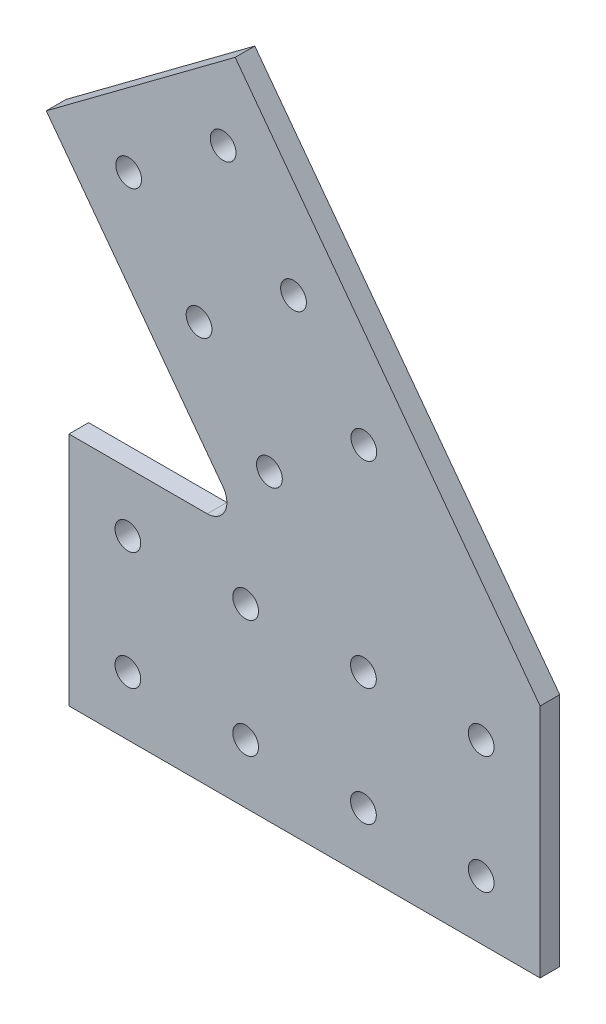
ISO-10303-21;
HEADER;
FILE_DESCRIPTION(('STEP AP214'),'2;1');
FILE_NAME('part.step','',(''),(''),'','','');
FILE_SCHEMA(('AUTOMOTIVE_DESIGN { 1 0 10303 214 1 1 1 1 }'));
ENDSEC;
DATA;
#1=APPLICATION_CONTEXT('core data for automotive mechanical design processes');
#2=APPLICATION_PROTOCOL_DEFINITION('international standard','automotive_design',2000,#1);
#3=PRODUCT_CONTEXT('',#1,'mechanical');
#4=PRODUCT('Part','Part','',(#3));
#5=PRODUCT_RELATED_PRODUCT_CATEGORY('part','',(#4));
#6=PRODUCT_DEFINITION_FORMATION('','',#4);
#7=PRODUCT_DEFINITION_CONTEXT('part definition',#1,'design');
#8=PRODUCT_DEFINITION('design','',#6,#7);
#9=PRODUCT_DEFINITION_SHAPE('','',#8);
#10=(LENGTH_UNIT() NAMED_UNIT(*) SI_UNIT(.MILLI.,.METRE.));
#11=(NAMED_UNIT(*) PLANE_ANGLE_UNIT() SI_UNIT($,.RADIAN.));
#12=(NAMED_UNIT(*) SI_UNIT($,.STERADIAN.) SOLID_ANGLE_UNIT());
#13=UNCERTAINTY_MEASURE_WITH_UNIT(LENGTH_MEASURE(1.E-05),#10,'distance_accuracy_value','');
#14=(GEOMETRIC_REPRESENTATION_CONTEXT(3) GLOBAL_UNCERTAINTY_ASSIGNED_CONTEXT((#13)) GLOBAL_UNIT_ASSIGNED_CONTEXT((#10,
#11,#12)) REPRESENTATION_CONTEXT('',''));
#15=CARTESIAN_POINT('',(0.,0.,0.));
#16=DIRECTION('',(0.,0.,1.));
#17=DIRECTION('',(1.,0.,0.));
#18=AXIS2_PLACEMENT_3D('',#15,#16,#17);
#19=CARTESIAN_POINT('',(19.05,57.15,6.35));
#20=DIRECTION('',(0.,0.,1.));
#21=DIRECTION('',(1.,0.,0.));
#22=AXIS2_PLACEMENT_3D('',#19,#20,#21);
#23=CYLINDRICAL_SURFACE('',#22,4.16725100000001);
#24=CARTESIAN_POINT('',(19.05,57.15,0.));
#25=DIRECTION('',(0.,0.,1.));
#26=DIRECTION('',(1.,0.,0.));
#27=AXIS2_PLACEMENT_3D('',#24,#25,#26);
#28=CIRCLE('',#27,4.16725100000001);
#29=CARTESIAN_POINT('',(23.217251,57.15,0.));
#30=VERTEX_POINT('',#29);
#31=EDGE_CURVE('E165',#30,#30,#28,.T.);
#32=ORIENTED_EDGE('',*,*,#31,.F.);
#33=EDGE_LOOP('',(#32));
#34=FACE_BOUND('',#33,.T.);
#35=CARTESIAN_POINT('',(19.05,57.15,6.35));
#36=DIRECTION('',(0.,0.,1.));
#37=DIRECTION('',(1.,0.,0.));
#38=AXIS2_PLACEMENT_3D('',#35,#36,#37);
#39=CIRCLE('',#38,4.16725100000001);
#40=CARTESIAN_POINT('',(23.217251,57.15,6.35));
#41=VERTEX_POINT('',#40);
#42=EDGE_CURVE('E168',#41,#41,#39,.T.);
#43=ORIENTED_EDGE('',*,*,#42,.T.);
#44=EDGE_LOOP('',(#43));
#45=FACE_BOUND('',#44,.T.);
#46=ADVANCED_FACE('F39',(#34,#45),#23,.F.);
#47=CARTESIAN_POINT('',(57.15,57.15,6.35));
#48=DIRECTION('',(0.,0.,1.));
#49=DIRECTION('',(1.,0.,0.));
#50=AXIS2_PLACEMENT_3D('',#47,#48,#49);
#51=CYLINDRICAL_SURFACE('',#50,4.16725100000001);
#52=CARTESIAN_POINT('',(57.15,57.15,0.));
#53=DIRECTION('',(0.,0.,1.));
#54=DIRECTION('',(1.,0.,0.));
#55=AXIS2_PLACEMENT_3D('',#52,#53,#54);
#56=CIRCLE('',#55,4.16725100000001);
#57=CARTESIAN_POINT('',(61.317251,57.15,0.));
#58=VERTEX_POINT('',#57);
#59=EDGE_CURVE('E159',#58,#58,#56,.T.);
#60=ORIENTED_EDGE('',*,*,#59,.F.);
#61=EDGE_LOOP('',(#60));
#62=FACE_BOUND('',#61,.T.);
#63=CARTESIAN_POINT('',(57.15,57.15,6.35));
#64=DIRECTION('',(0.,0.,1.));
#65=DIRECTION('',(1.,0.,0.));
#66=AXIS2_PLACEMENT_3D('',#63,#64,#65);
#67=CIRCLE('',#66,4.16725100000001);
#68=CARTESIAN_POINT('',(61.317251,57.15,6.35));
#69=VERTEX_POINT('',#68);
#70=EDGE_CURVE('E162',#69,#69,#67,.T.);
#71=ORIENTED_EDGE('',*,*,#70,.T.);
#72=EDGE_LOOP('',(#71));
#73=FACE_BOUND('',#72,.T.);
#74=ADVANCED_FACE('F305',(#62,#73),#51,.F.);
#75=CARTESIAN_POINT('',(95.25,57.15,6.35));
#76=DIRECTION('',(0.,0.,1.));
#77=DIRECTION('',(1.,0.,0.));
#78=AXIS2_PLACEMENT_3D('',#75,#76,#77);
#79=CYLINDRICAL_SURFACE('',#78,4.16725100000001);
#80=CARTESIAN_POINT('',(95.25,57.15,0.));
#81=DIRECTION('',(0.,0.,1.));
#82=DIRECTION('',(1.,0.,0.));
#83=AXIS2_PLACEMENT_3D('',#80,#81,#82);
#84=CIRCLE('',#83,4.16725100000001);
#85=CARTESIAN_POINT('',(99.417251,57.15,0.));
#86=VERTEX_POINT('',#85);
#87=EDGE_CURVE('E153',#86,#86,#84,.T.);
#88=ORIENTED_EDGE('',*,*,#87,.F.);
#89=EDGE_LOOP('',(#88));
#90=FACE_BOUND('',#89,.T.);
#91=CARTESIAN_POINT('',(95.25,57.15,6.35));
#92=DIRECTION('',(0.,0.,1.));
#93=DIRECTION('',(1.,0.,0.));
#94=AXIS2_PLACEMENT_3D('',#91,#92,#93);
#95=CIRCLE('',#94,4.16725100000001);
#96=CARTESIAN_POINT('',(99.417251,57.15,6.35));
#97=VERTEX_POINT('',#96);
#98=EDGE_CURVE('E156',#97,#97,#95,.T.);
#99=ORIENTED_EDGE('',*,*,#98,.T.);
#100=EDGE_LOOP('',(#99));
#101=FACE_BOUND('',#100,.T.);
#102=ADVANCED_FACE('F310',(#90,#101),#79,.F.);
#103=CARTESIAN_POINT('',(133.35,57.15,6.35));
#104=DIRECTION('',(0.,0.,1.));
#105=DIRECTION('',(1.,0.,0.));
#106=AXIS2_PLACEMENT_3D('',#103,#104,#105);
#107=CYLINDRICAL_SURFACE('',#106,4.16725100000001);
#108=CARTESIAN_POINT('',(133.35,57.15,0.));
#109=DIRECTION('',(0.,0.,1.));
#110=DIRECTION('',(1.,0.,0.));
#111=AXIS2_PLACEMENT_3D('',#108,#109,#110);
#112=CIRCLE('',#111,4.16725100000001);
#113=CARTESIAN_POINT('',(137.517251,57.15,0.));
#114=VERTEX_POINT('',#113);
#115=EDGE_CURVE('E147',#114,#114,#112,.T.);
#116=ORIENTED_EDGE('',*,*,#115,.F.);
#117=EDGE_LOOP('',(#116));
#118=FACE_BOUND('',#117,.T.);
#119=CARTESIAN_POINT('',(133.35,57.15,6.35));
#120=DIRECTION('',(0.,0.,1.));
#121=DIRECTION('',(1.,0.,0.));
#122=AXIS2_PLACEMENT_3D('',#119,#120,#121);
#123=CIRCLE('',#122,4.16725100000001);
#124=CARTESIAN_POINT('',(137.517251,57.15,6.35));
#125=VERTEX_POINT('',#124);
#126=EDGE_CURVE('E150',#125,#125,#123,.T.);
#127=ORIENTED_EDGE('',*,*,#126,.T.);
#128=EDGE_LOOP('',(#127));
#129=FACE_BOUND('',#128,.T.);
#130=ADVANCED_FACE('F318',(#118,#129),#107,.F.);
#131=CARTESIAN_POINT('',(19.05,19.05,6.35));
#132=DIRECTION('',(0.,0.,1.));
#133=DIRECTION('',(1.,0.,0.));
#134=AXIS2_PLACEMENT_3D('',#131,#132,#133);
#135=CYLINDRICAL_SURFACE('',#134,4.16725100000001);
#136=CARTESIAN_POINT('',(19.05,19.05,0.));
#137=DIRECTION('',(0.,0.,1.));
#138=DIRECTION('',(1.,0.,0.));
#139=AXIS2_PLACEMENT_3D('',#136,#137,#138);
#140=CIRCLE('',#139,4.16725100000001);
#141=CARTESIAN_POINT('',(23.217251,19.05,0.));
#142=VERTEX_POINT('',#141);
#143=EDGE_CURVE('E141',#142,#142,#140,.T.);
#144=ORIENTED_EDGE('',*,*,#143,.F.);
#145=EDGE_LOOP('',(#144));
#146=FACE_BOUND('',#145,.T.);
#147=CARTESIAN_POINT('',(19.05,19.05,6.35));
#148=DIRECTION('',(0.,0.,1.));
#149=DIRECTION('',(1.,0.,0.));
#150=AXIS2_PLACEMENT_3D('',#147,#148,#149);
#151=CIRCLE('',#150,4.16725100000001);
#152=CARTESIAN_POINT('',(23.217251,19.05,6.35));
#153=VERTEX_POINT('',#152);
#154=EDGE_CURVE('E144',#153,#153,#151,.T.);
#155=ORIENTED_EDGE('',*,*,#154,.T.);
#156=EDGE_LOOP('',(#155));
#157=FACE_BOUND('',#156,.T.);
#158=ADVANCED_FACE('F322',(#146,#157),#135,.F.);
#159=CARTESIAN_POINT('',(57.15,19.05,6.35));
#160=DIRECTION('',(0.,0.,1.));
#161=DIRECTION('',(1.,0.,0.));
#162=AXIS2_PLACEMENT_3D('',#159,#160,#161);
#163=CYLINDRICAL_SURFACE('',#162,4.16725100000001);
#164=CARTESIAN_POINT('',(57.15,19.05,0.));
#165=DIRECTION('',(0.,0.,1.));
#166=DIRECTION('',(1.,0.,0.));
#167=AXIS2_PLACEMENT_3D('',#164,#165,#166);
#168=CIRCLE('',#167,4.16725100000001);
#169=CARTESIAN_POINT('',(61.317251,19.05,0.));
#170=VERTEX_POINT('',#169);
#171=EDGE_CURVE('E130',#170,#170,#168,.T.);
#172=ORIENTED_EDGE('',*,*,#171,.F.);
#173=EDGE_LOOP('',(#172));
#174=FACE_BOUND('',#173,.T.);
#175=CARTESIAN_POINT('',(57.15,19.05,6.35));
#176=DIRECTION('',(0.,0.,1.));
#177=DIRECTION('',(1.,0.,0.));
#178=AXIS2_PLACEMENT_3D('',#175,#176,#177);
#179=CIRCLE('',#178,4.16725100000001);
#180=CARTESIAN_POINT('',(61.317251,19.05,6.35));
#181=VERTEX_POINT('',#180);
#182=EDGE_CURVE('E133',#181,#181,#179,.T.);
#183=ORIENTED_EDGE('',*,*,#182,.T.);
#184=EDGE_LOOP('',(#183));
#185=FACE_BOUND('',#184,.T.);
#186=ADVANCED_FACE('F326',(#174,#185),#163,.F.);
#187=CARTESIAN_POINT('',(0.,76.2,6.35));
#188=DIRECTION('',(1.,0.,0.));
#189=DIRECTION('',(0.,1.,0.));
#190=AXIS2_PLACEMENT_3D('',#187,#188,#189);
#191=PLANE('',#190);
#192=DIRECTION('',(0.,-1.,0.));
#193=VECTOR('',#192,1.);
#194=CARTESIAN_POINT('',(0.,76.2,0.));
#195=LINE('',#194,#193);
#196=CARTESIAN_POINT('',(0.,76.2,0.));
#197=VERTEX_POINT('',#196);
#198=CARTESIAN_POINT('',(0.,0.,0.));
#199=VERTEX_POINT('',#198);
#200=EDGE_CURVE('E129',#197,#199,#195,.T.);
#201=ORIENTED_EDGE('',*,*,#200,.T.);
#202=DIRECTION('',(0.,0.,-1.));
#203=VECTOR('',#202,1.);
#204=CARTESIAN_POINT('',(0.,0.,6.35));
#205=LINE('',#204,#203);
#206=CARTESIAN_POINT('',(0.,0.,6.35));
#207=VERTEX_POINT('',#206);
#208=EDGE_CURVE('E108',#207,#199,#205,.T.);
#209=ORIENTED_EDGE('',*,*,#208,.F.);
#210=DIRECTION('',(0.,-1.,0.));
#211=VECTOR('',#210,1.);
#212=CARTESIAN_POINT('',(0.,76.2,6.35));
#213=LINE('',#212,#211);
#214=CARTESIAN_POINT('',(0.,76.2,6.35));
#215=VERTEX_POINT('',#214);
#216=EDGE_CURVE('E115',#215,#207,#213,.T.);
#217=ORIENTED_EDGE('',*,*,#216,.F.);
#218=DIRECTION('',(0.,0.,-1.));
#219=VECTOR('',#218,1.);
#220=CARTESIAN_POINT('',(0.,76.2,6.35));
#221=LINE('',#220,#219);
#222=EDGE_CURVE('E187',#215,#197,#221,.T.);
#223=ORIENTED_EDGE('',*,*,#222,.T.);
#224=EDGE_LOOP('',(#201,#209,#217,#223));
#225=FACE_BOUND('',#224,.T.);
#226=ADVANCED_FACE('F127',(#225),#191,.F.);
#227=CARTESIAN_POINT('',(0.,0.,6.35));
#228=DIRECTION('',(0.,1.,0.));
#229=DIRECTION('',(0.,0.,1.));
#230=AXIS2_PLACEMENT_3D('',#227,#228,#229);
#231=PLANE('',#230);
#232=DIRECTION('',(1.,0.,0.));
#233=VECTOR('',#232,1.);
#234=CARTESIAN_POINT('',(0.,0.,0.));
#235=LINE('',#234,#233);
#236=CARTESIAN_POINT('',(152.4,0.,0.));
#237=VERTEX_POINT('',#236);
#238=EDGE_CURVE('E208',#199,#237,#235,.T.);
#239=ORIENTED_EDGE('',*,*,#238,.T.);
#240=DIRECTION('',(0.,0.,-1.));
#241=VECTOR('',#240,1.);
#242=CARTESIAN_POINT('',(152.4,0.,6.35));
#243=LINE('',#242,#241);
#244=CARTESIAN_POINT('',(152.4,0.,6.35));
#245=VERTEX_POINT('',#244);
#246=EDGE_CURVE('E111',#245,#237,#243,.T.);
#247=ORIENTED_EDGE('',*,*,#246,.F.);
#248=DIRECTION('',(1.,0.,0.));
#249=VECTOR('',#248,1.);
#250=CARTESIAN_POINT('',(0.,0.,6.35));
#251=LINE('',#250,#249);
#252=EDGE_CURVE('E104',#207,#245,#251,.T.);
#253=ORIENTED_EDGE('',*,*,#252,.F.);
#254=ORIENTED_EDGE('',*,*,#208,.T.);
#255=EDGE_LOOP('',(#239,#247,#253,#254));
#256=FACE_BOUND('',#255,.T.);
#257=ADVANCED_FACE('F106',(#256),#231,.F.);
#258=CARTESIAN_POINT('',(152.4,0.,6.35));
#259=DIRECTION('',(-1.,0.,0.));
#260=DIRECTION('',(0.,0.,1.));
#261=AXIS2_PLACEMENT_3D('',#258,#259,#260);
#262=PLANE('',#261);
#263=DIRECTION('',(0.,1.,0.));
#264=VECTOR('',#263,1.);
#265=CARTESIAN_POINT('',(152.4,0.,0.));
#266=LINE('',#265,#264);
#267=CARTESIAN_POINT('',(152.4,76.2,0.));
#268=VERTEX_POINT('',#267);
#269=EDGE_CURVE('E206',#237,#268,#266,.T.);
#270=ORIENTED_EDGE('',*,*,#269,.T.);
#271=DIRECTION('',(0.,0.,-1.));
#272=VECTOR('',#271,1.);
#273=CARTESIAN_POINT('',(152.4,76.2,6.35));
#274=LINE('',#273,#272);
#275=CARTESIAN_POINT('',(152.4,76.2,6.35));
#276=VERTEX_POINT('',#275);
#277=EDGE_CURVE('E135',#276,#268,#274,.T.);
#278=ORIENTED_EDGE('',*,*,#277,.F.);
#279=DIRECTION('',(0.,1.,0.));
#280=VECTOR('',#279,1.);
#281=CARTESIAN_POINT('',(152.4,0.,6.35));
#282=LINE('',#281,#280);
#283=EDGE_CURVE('E114',#245,#276,#282,.T.);
#284=ORIENTED_EDGE('',*,*,#283,.F.);
#285=ORIENTED_EDGE('',*,*,#246,.T.);
#286=EDGE_LOOP('',(#270,#278,#284,#285));
#287=FACE_BOUND('',#286,.T.);
#288=ADVANCED_FACE('F335',(#287),#262,.F.);
#289=CARTESIAN_POINT('',(152.4,76.2,6.35));
#290=DIRECTION('',(-0.801879937296559,-0.597485201625335,0.));
#291=DIRECTION('',(0.597485201625335,-0.801879937296559,0.));
#292=AXIS2_PLACEMENT_3D('',#289,#290,#291);
#293=PLANE('',#292);
#294=DIRECTION('',(-0.597485201625335,0.801879937296559,0.));
#295=VECTOR('',#294,1.);
#296=CARTESIAN_POINT('',(152.4,76.2,0.));
#297=LINE('',#296,#295);
#298=CARTESIAN_POINT('',(53.7551932116572,208.590377647662,0.));
#299=VERTEX_POINT('',#298);
#300=EDGE_CURVE('E201',#268,#299,#297,.T.);
#301=ORIENTED_EDGE('',*,*,#300,.T.);
#302=DIRECTION('',(0.,0.,-1.));
#303=VECTOR('',#302,1.);
#304=CARTESIAN_POINT('',(53.7551932116572,208.590377647662,6.35));
#305=LINE('',#304,#303);
#306=CARTESIAN_POINT('',(53.7551932116572,208.590377647662,6.35));
#307=VERTEX_POINT('',#306);
#308=EDGE_CURVE('E192',#307,#299,#305,.T.);
#309=ORIENTED_EDGE('',*,*,#308,.F.);
#310=DIRECTION('',(-0.597485201625335,0.801879937296559,0.));
#311=VECTOR('',#310,1.);
#312=CARTESIAN_POINT('',(152.4,76.2,6.35));
#313=LINE('',#312,#311);
#314=EDGE_CURVE('E202',#276,#307,#313,.T.);
#315=ORIENTED_EDGE('',*,*,#314,.F.);
#316=ORIENTED_EDGE('',*,*,#277,.T.);
#317=EDGE_LOOP('',(#301,#309,#315,#316));
#318=FACE_BOUND('',#317,.T.);
#319=ADVANCED_FACE('F199',(#318),#293,.F.);
#320=CARTESIAN_POINT('',(53.7551932116572,208.590377647662,6.35));
#321=DIRECTION('',(0.597485201625335,-0.801879937296559,0.));
#322=DIRECTION('',(0.801879937296559,0.597485201625335,0.));
#323=AXIS2_PLACEMENT_3D('',#320,#321,#322);
#324=PLANE('',#323);
#325=DIRECTION('',(-0.801879937296559,-0.597485201625335,0.));
#326=VECTOR('',#325,1.);
#327=CARTESIAN_POINT('',(53.7551932116572,208.590377647662,0.));
#328=LINE('',#327,#326);
#329=CARTESIAN_POINT('',(-7.34805801034058,163.062005283811,0.));
#330=VERTEX_POINT('',#329);
#331=EDGE_CURVE('E183',#299,#330,#328,.T.);
#332=ORIENTED_EDGE('',*,*,#331,.T.);
#333=DIRECTION('',(0.,0.,-1.));
#334=VECTOR('',#333,1.);
#335=CARTESIAN_POINT('',(-7.34805801034058,163.062005283811,6.35));
#336=LINE('',#335,#334);
#337=CARTESIAN_POINT('',(-7.34805801034058,163.062005283811,6.35));
#338=VERTEX_POINT('',#337);
#339=EDGE_CURVE('E189',#338,#330,#336,.T.);
#340=ORIENTED_EDGE('',*,*,#339,.F.);
#341=DIRECTION('',(-0.801879937296559,-0.597485201625335,0.));
#342=VECTOR('',#341,1.);
#343=CARTESIAN_POINT('',(53.7551932116572,208.590377647662,6.35));
#344=LINE('',#343,#342);
#345=EDGE_CURVE('E217',#307,#338,#344,.T.);
#346=ORIENTED_EDGE('',*,*,#345,.F.);
#347=ORIENTED_EDGE('',*,*,#308,.T.);
#348=EDGE_LOOP('',(#332,#340,#346,#347));
#349=FACE_BOUND('',#348,.T.);
#350=ADVANCED_FACE('F340',(#349),#324,.F.);
#351=CARTESIAN_POINT('',(-7.34805801034058,163.062005283811,6.35));
#352=DIRECTION('',(0.801879937296558,0.597485201625335,0.));
#353=DIRECTION('',(-0.597485201625335,0.801879937296558,0.));
#354=AXIS2_PLACEMENT_3D('',#351,#352,#353);
#355=PLANE('',#354);
#356=DIRECTION('',(0.597485201625335,-0.801879937296558,0.));
#357=VECTOR('',#356,1.);
#358=CARTESIAN_POINT('',(-7.34805801034058,163.062005283811,0.));
#359=LINE('',#358,#357);
#360=CARTESIAN_POINT('',(49.8149313390012,86.3440310303209,0.));
#361=VERTEX_POINT('',#360);
#362=EDGE_CURVE('E181',#330,#361,#359,.T.);
#363=ORIENTED_EDGE('',*,*,#362,.T.);
#364=DIRECTION('',(0.,0.,-1.));
#365=VECTOR('',#364,1.);
#366=CARTESIAN_POINT('',(49.8149313390012,86.3440310303209,6.35));
#367=LINE('',#366,#365);
#368=CARTESIAN_POINT('',(49.8149313390012,86.3440310303209,6.35));
#369=VERTEX_POINT('',#368);
#370=EDGE_CURVE('E54',#361,#369,#367,.F.);
#371=ORIENTED_EDGE('',*,*,#370,.T.);
#372=DIRECTION('',(0.597485201625335,-0.801879937296558,0.));
#373=VECTOR('',#372,1.);
#374=CARTESIAN_POINT('',(-7.34805801034058,163.062005283811,6.35));
#375=LINE('',#374,#373);
#376=EDGE_CURVE('E215',#338,#369,#375,.T.);
#377=ORIENTED_EDGE('',*,*,#376,.F.);
#378=ORIENTED_EDGE('',*,*,#339,.T.);
#379=EDGE_LOOP('',(#363,#371,#377,#378));
#380=FACE_BOUND('',#379,.T.);
#381=ADVANCED_FACE('F342',(#380),#355,.F.);
#382=CARTESIAN_POINT('',(57.3733052844556,76.2,6.35));
#383=DIRECTION('',(0.,-1.,0.));
#384=DIRECTION('',(1.,0.,0.));
#385=AXIS2_PLACEMENT_3D('',#382,#383,#384);
#386=PLANE('',#385);
#387=DIRECTION('',(-1.,0.,0.));
#388=VECTOR('',#387,1.);
#389=CARTESIAN_POINT('',(57.3733052844556,76.2,6.35));
#390=LINE('',#389,#388);
#391=CARTESIAN_POINT('',(44.7229937371681,76.2,6.35));
#392=VERTEX_POINT('',#391);
#393=EDGE_CURVE('E121',#392,#215,#390,.T.);
#394=ORIENTED_EDGE('',*,*,#393,.F.);
#395=DIRECTION('',(0.,0.,-1.));
#396=VECTOR('',#395,1.);
#397=CARTESIAN_POINT('',(44.7229937371681,76.2,0.));
#398=LINE('',#397,#396);
#399=CARTESIAN_POINT('',(44.7229937371681,76.2,0.));
#400=VERTEX_POINT('',#399);
#401=EDGE_CURVE('E171',#392,#400,#398,.T.);
#402=ORIENTED_EDGE('',*,*,#401,.T.);
#403=DIRECTION('',(-1.,0.,0.));
#404=VECTOR('',#403,1.);
#405=CARTESIAN_POINT('',(57.3733052844556,76.2,0.));
#406=LINE('',#405,#404);
#407=EDGE_CURVE('E125',#400,#197,#406,.T.);
#408=ORIENTED_EDGE('',*,*,#407,.T.);
#409=ORIENTED_EDGE('',*,*,#222,.F.);
#410=EDGE_LOOP('',(#394,#402,#408,#409));
#411=FACE_BOUND('',#410,.T.);
#412=ADVANCED_FACE('F176',(#411),#386,.F.);
#413=CARTESIAN_POINT('',(0.,0.,6.35));
#414=DIRECTION('',(0.,0.,1.));
#415=DIRECTION('',(1.,0.,0.));
#416=AXIS2_PLACEMENT_3D('',#413,#414,#415);
#417=PLANE('',#416);
#418=CARTESIAN_POINT('',(64.838220249972,98.0650343472768,6.35));
#419=DIRECTION('',(0.,0.,1.));
#420=DIRECTION('',(1.,0.,0.));
#421=AXIS2_PLACEMENT_3D('',#418,#419,#420);
#422=CIRCLE('',#421,4.167251);
#423=CARTESIAN_POINT('',(69.005471249972,98.0650343472768,6.35));
#424=VERTEX_POINT('',#423);
#425=EDGE_CURVE('E265',#424,#424,#422,.T.);
#426=ORIENTED_EDGE('',*,*,#425,.F.);
#427=EDGE_LOOP('',(#426));
#428=FACE_BOUND('',#427,.T.);
#429=CARTESIAN_POINT('',(95.3898458609709,120.829220529202,6.35));
#430=DIRECTION('',(0.,0.,1.));
#431=DIRECTION('',(1.,0.,0.));
#432=AXIS2_PLACEMENT_3D('',#429,#430,#431);
#433=CIRCLE('',#432,4.167251);
#434=CARTESIAN_POINT('',(99.5570968609709,120.829220529202,6.35));
#435=VERTEX_POINT('',#434);
#436=EDGE_CURVE('E259',#435,#435,#433,.T.);
#437=ORIENTED_EDGE('',*,*,#436,.F.);
#438=EDGE_LOOP('',(#437));
#439=FACE_BOUND('',#438,.T.);
#440=CARTESIAN_POINT('',(42.0740340680468,128.616659958276,6.35));
#441=DIRECTION('',(0.,0.,1.));
#442=DIRECTION('',(1.,0.,0.));
#443=AXIS2_PLACEMENT_3D('',#440,#441,#442);
#444=CIRCLE('',#443,4.167251);
#445=CARTESIAN_POINT('',(46.2412850680468,128.616659958276,6.35));
#446=VERTEX_POINT('',#445);
#447=EDGE_CURVE('E253',#446,#446,#444,.T.);
#448=ORIENTED_EDGE('',*,*,#447,.F.);
#449=EDGE_LOOP('',(#448));
#450=FACE_BOUND('',#449,.T.);
#451=CARTESIAN_POINT('',(72.6256596790457,151.380846140201,6.35));
#452=DIRECTION('',(0.,0.,1.));
#453=DIRECTION('',(1.,0.,0.));
#454=AXIS2_PLACEMENT_3D('',#451,#452,#453);
#455=CIRCLE('',#454,4.167251);
#456=CARTESIAN_POINT('',(76.7929106790457,151.380846140201,6.35));
#457=VERTEX_POINT('',#456);
#458=EDGE_CURVE('E247',#457,#457,#455,.T.);
#459=ORIENTED_EDGE('',*,*,#458,.F.);
#460=EDGE_LOOP('',(#459));
#461=FACE_BOUND('',#460,.T.);
#462=CARTESIAN_POINT('',(19.3098478861215,159.168285569275,6.35));
#463=DIRECTION('',(0.,0.,1.));
#464=DIRECTION('',(1.,0.,0.));
#465=AXIS2_PLACEMENT_3D('',#462,#463,#464);
#466=CIRCLE('',#465,4.167251);
#467=CARTESIAN_POINT('',(23.4770988861215,159.168285569275,6.35));
#468=VERTEX_POINT('',#467);
#469=EDGE_CURVE('E241',#468,#468,#466,.T.);
#470=ORIENTED_EDGE('',*,*,#469,.F.);
#471=EDGE_LOOP('',(#470));
#472=FACE_BOUND('',#471,.T.);
#473=CARTESIAN_POINT('',(49.8614734971204,181.9324717512,6.35));
#474=DIRECTION('',(0.,0.,1.));
#475=DIRECTION('',(1.,0.,0.));
#476=AXIS2_PLACEMENT_3D('',#473,#474,#475);
#477=CIRCLE('',#476,4.167251);
#478=CARTESIAN_POINT('',(54.0287244971204,181.9324717512,6.35));
#479=VERTEX_POINT('',#478);
#480=EDGE_CURVE('E235',#479,#479,#477,.T.);
#481=ORIENTED_EDGE('',*,*,#480,.F.);
#482=EDGE_LOOP('',(#481));
#483=FACE_BOUND('',#482,.T.);
#484=CARTESIAN_POINT('',(95.25,19.05,6.35));
#485=DIRECTION('',(0.,0.,1.));
#486=DIRECTION('',(1.,0.,0.));
#487=AXIS2_PLACEMENT_3D('',#484,#485,#486);
#488=CIRCLE('',#487,4.16725100000001);
#489=CARTESIAN_POINT('',(99.417251,19.05,6.35));
#490=VERTEX_POINT('',#489);
#491=EDGE_CURVE('E226',#490,#490,#488,.T.);
#492=ORIENTED_EDGE('',*,*,#491,.F.);
#493=EDGE_LOOP('',(#492));
#494=FACE_BOUND('',#493,.T.);
#495=CARTESIAN_POINT('',(133.35,19.05,6.35));
#496=DIRECTION('',(0.,0.,1.));
#497=DIRECTION('',(1.,0.,0.));
#498=AXIS2_PLACEMENT_3D('',#495,#496,#497);
#499=CIRCLE('',#498,4.16725100000001);
#500=CARTESIAN_POINT('',(137.517251,19.05,6.35));
#501=VERTEX_POINT('',#500);
#502=EDGE_CURVE('E223',#501,#501,#499,.T.);
#503=ORIENTED_EDGE('',*,*,#502,.F.);
#504=EDGE_LOOP('',(#503));
#505=FACE_BOUND('',#504,.T.);
#506=ORIENTED_EDGE('',*,*,#216,.T.);
#507=ORIENTED_EDGE('',*,*,#252,.T.);
#508=ORIENTED_EDGE('',*,*,#283,.T.);
#509=ORIENTED_EDGE('',*,*,#314,.T.);
#510=ORIENTED_EDGE('',*,*,#345,.T.);
#511=ORIENTED_EDGE('',*,*,#376,.T.);
#512=CARTESIAN_POINT('',(44.7229937371681,82.55,6.35));
#513=DIRECTION('',(0.,0.,1.));
#514=DIRECTION('',(1.,0.,0.));
#515=AXIS2_PLACEMENT_3D('',#512,#513,#514);
#516=CIRCLE('',#515,6.35);
#517=EDGE_CURVE('E11',#369,#392,#516,.F.);
#518=ORIENTED_EDGE('',*,*,#517,.T.);
#519=ORIENTED_EDGE('',*,*,#393,.T.);
#520=EDGE_LOOP('',(#506,#507,#508,#509,#510,#511,#518,#519));
#521=FACE_BOUND('',#520,.T.);
#522=ORIENTED_EDGE('',*,*,#182,.F.);
#523=EDGE_LOOP('',(#522));
#524=FACE_BOUND('',#523,.T.);
#525=ORIENTED_EDGE('',*,*,#154,.F.);
#526=EDGE_LOOP('',(#525));
#527=FACE_BOUND('',#526,.T.);
#528=ORIENTED_EDGE('',*,*,#126,.F.);
#529=EDGE_LOOP('',(#528));
#530=FACE_BOUND('',#529,.T.);
#531=ORIENTED_EDGE('',*,*,#98,.F.);
#532=EDGE_LOOP('',(#531));
#533=FACE_BOUND('',#532,.T.);
#534=ORIENTED_EDGE('',*,*,#70,.F.);
#535=EDGE_LOOP('',(#534));
#536=FACE_BOUND('',#535,.T.);
#537=ORIENTED_EDGE('',*,*,#42,.F.);
#538=EDGE_LOOP('',(#537));
#539=FACE_BOUND('',#538,.T.);
#540=ADVANCED_FACE('F118',(#428,#439,#450,#461,#472,#483,#494,#505,#521,#524,#527,#530,#533,
#536,#539),#417,.T.);
#541=CARTESIAN_POINT('',(0.,0.,0.));
#542=DIRECTION('',(0.,0.,1.));
#543=DIRECTION('',(1.,0.,0.));
#544=AXIS2_PLACEMENT_3D('',#541,#542,#543);
#545=PLANE('',#544);
#546=CARTESIAN_POINT('',(64.838220249972,98.0650343472768,0.));
#547=DIRECTION('',(0.,0.,1.));
#548=DIRECTION('',(1.,0.,0.));
#549=AXIS2_PLACEMENT_3D('',#546,#547,#548);
#550=CIRCLE('',#549,4.167251);
#551=CARTESIAN_POINT('',(69.005471249972,98.0650343472768,0.));
#552=VERTEX_POINT('',#551);
#553=EDGE_CURVE('E262',#552,#552,#550,.T.);
#554=ORIENTED_EDGE('',*,*,#553,.T.);
#555=EDGE_LOOP('',(#554));
#556=FACE_BOUND('',#555,.T.);
#557=CARTESIAN_POINT('',(95.3898458609709,120.829220529202,0.));
#558=DIRECTION('',(0.,0.,1.));
#559=DIRECTION('',(1.,0.,0.));
#560=AXIS2_PLACEMENT_3D('',#557,#558,#559);
#561=CIRCLE('',#560,4.167251);
#562=CARTESIAN_POINT('',(99.5570968609709,120.829220529202,0.));
#563=VERTEX_POINT('',#562);
#564=EDGE_CURVE('E256',#563,#563,#561,.T.);
#565=ORIENTED_EDGE('',*,*,#564,.T.);
#566=EDGE_LOOP('',(#565));
#567=FACE_BOUND('',#566,.T.);
#568=CARTESIAN_POINT('',(42.0740340680468,128.616659958276,0.));
#569=DIRECTION('',(0.,0.,1.));
#570=DIRECTION('',(1.,0.,0.));
#571=AXIS2_PLACEMENT_3D('',#568,#569,#570);
#572=CIRCLE('',#571,4.167251);
#573=CARTESIAN_POINT('',(46.2412850680468,128.616659958276,0.));
#574=VERTEX_POINT('',#573);
#575=EDGE_CURVE('E250',#574,#574,#572,.T.);
#576=ORIENTED_EDGE('',*,*,#575,.T.);
#577=EDGE_LOOP('',(#576));
#578=FACE_BOUND('',#577,.T.);
#579=CARTESIAN_POINT('',(72.6256596790457,151.380846140201,0.));
#580=DIRECTION('',(0.,0.,1.));
#581=DIRECTION('',(1.,0.,0.));
#582=AXIS2_PLACEMENT_3D('',#579,#580,#581);
#583=CIRCLE('',#582,4.167251);
#584=CARTESIAN_POINT('',(76.7929106790457,151.380846140201,0.));
#585=VERTEX_POINT('',#584);
#586=EDGE_CURVE('E244',#585,#585,#583,.T.);
#587=ORIENTED_EDGE('',*,*,#586,.T.);
#588=EDGE_LOOP('',(#587));
#589=FACE_BOUND('',#588,.T.);
#590=CARTESIAN_POINT('',(19.3098478861215,159.168285569275,0.));
#591=DIRECTION('',(0.,0.,1.));
#592=DIRECTION('',(1.,0.,0.));
#593=AXIS2_PLACEMENT_3D('',#590,#591,#592);
#594=CIRCLE('',#593,4.167251);
#595=CARTESIAN_POINT('',(23.4770988861215,159.168285569275,0.));
#596=VERTEX_POINT('',#595);
#597=EDGE_CURVE('E238',#596,#596,#594,.T.);
#598=ORIENTED_EDGE('',*,*,#597,.T.);
#599=EDGE_LOOP('',(#598));
#600=FACE_BOUND('',#599,.T.);
#601=CARTESIAN_POINT('',(49.8614734971204,181.9324717512,0.));
#602=DIRECTION('',(0.,0.,1.));
#603=DIRECTION('',(1.,0.,0.));
#604=AXIS2_PLACEMENT_3D('',#601,#602,#603);
#605=CIRCLE('',#604,4.167251);
#606=CARTESIAN_POINT('',(54.0287244971204,181.9324717512,0.));
#607=VERTEX_POINT('',#606);
#608=EDGE_CURVE('E232',#607,#607,#605,.T.);
#609=ORIENTED_EDGE('',*,*,#608,.T.);
#610=EDGE_LOOP('',(#609));
#611=FACE_BOUND('',#610,.T.);
#612=CARTESIAN_POINT('',(95.25,19.05,0.));
#613=DIRECTION('',(0.,0.,1.));
#614=DIRECTION('',(1.,0.,0.));
#615=AXIS2_PLACEMENT_3D('',#612,#613,#614);
#616=CIRCLE('',#615,4.16725100000001);
#617=CARTESIAN_POINT('',(99.417251,19.05,0.));
#618=VERTEX_POINT('',#617);
#619=EDGE_CURVE('E229',#618,#618,#616,.T.);
#620=ORIENTED_EDGE('',*,*,#619,.T.);
#621=EDGE_LOOP('',(#620));
#622=FACE_BOUND('',#621,.T.);
#623=CARTESIAN_POINT('',(133.35,19.05,0.));
#624=DIRECTION('',(0.,0.,1.));
#625=DIRECTION('',(1.,0.,0.));
#626=AXIS2_PLACEMENT_3D('',#623,#624,#625);
#627=CIRCLE('',#626,4.16725100000001);
#628=CARTESIAN_POINT('',(137.517251,19.05,0.));
#629=VERTEX_POINT('',#628);
#630=EDGE_CURVE('E213',#629,#629,#627,.T.);
#631=ORIENTED_EDGE('',*,*,#630,.T.);
#632=EDGE_LOOP('',(#631));
#633=FACE_BOUND('',#632,.T.);
#634=ORIENTED_EDGE('',*,*,#200,.F.);
#635=ORIENTED_EDGE('',*,*,#407,.F.);
#636=CARTESIAN_POINT('',(44.7229937371681,82.55,0.));
#637=DIRECTION('',(0.,0.,1.));
#638=DIRECTION('',(1.,0.,0.));
#639=AXIS2_PLACEMENT_3D('',#636,#637,#638);
#640=CIRCLE('',#639,6.35);
#641=EDGE_CURVE('E47',#400,#361,#640,.T.);
#642=ORIENTED_EDGE('',*,*,#641,.T.);
#643=ORIENTED_EDGE('',*,*,#362,.F.);
#644=ORIENTED_EDGE('',*,*,#331,.F.);
#645=ORIENTED_EDGE('',*,*,#300,.F.);
#646=ORIENTED_EDGE('',*,*,#269,.F.);
#647=ORIENTED_EDGE('',*,*,#238,.F.);
#648=EDGE_LOOP('',(#634,#635,#642,#643,#644,#645,#646,#647));
#649=FACE_BOUND('',#648,.T.);
#650=ORIENTED_EDGE('',*,*,#171,.T.);
#651=EDGE_LOOP('',(#650));
#652=FACE_BOUND('',#651,.T.);
#653=ORIENTED_EDGE('',*,*,#143,.T.);
#654=EDGE_LOOP('',(#653));
#655=FACE_BOUND('',#654,.T.);
#656=ORIENTED_EDGE('',*,*,#115,.T.);
#657=EDGE_LOOP('',(#656));
#658=FACE_BOUND('',#657,.T.);
#659=ORIENTED_EDGE('',*,*,#87,.T.);
#660=EDGE_LOOP('',(#659));
#661=FACE_BOUND('',#660,.T.);
#662=ORIENTED_EDGE('',*,*,#59,.T.);
#663=EDGE_LOOP('',(#662));
#664=FACE_BOUND('',#663,.T.);
#665=ORIENTED_EDGE('',*,*,#31,.T.);
#666=EDGE_LOOP('',(#665));
#667=FACE_BOUND('',#666,.T.);
#668=ADVANCED_FACE('F179',(#556,#567,#578,#589,#600,#611,#622,#633,#649,#652,#655,#658,#661,
#664,#667),#545,.F.);
#669=CARTESIAN_POINT('',(133.35,19.05,6.35));
#670=DIRECTION('',(0.,0.,1.));
#671=DIRECTION('',(1.,0.,0.));
#672=AXIS2_PLACEMENT_3D('',#669,#670,#671);
#673=CYLINDRICAL_SURFACE('',#672,4.16725100000001);
#674=ORIENTED_EDGE('',*,*,#630,.F.);
#675=EDGE_LOOP('',(#674));
#676=FACE_BOUND('',#675,.T.);
#677=ORIENTED_EDGE('',*,*,#502,.T.);
#678=EDGE_LOOP('',(#677));
#679=FACE_BOUND('',#678,.T.);
#680=ADVANCED_FACE('F288',(#676,#679),#673,.F.);
#681=CARTESIAN_POINT('',(95.25,19.05,6.35));
#682=DIRECTION('',(0.,0.,1.));
#683=DIRECTION('',(1.,0.,0.));
#684=AXIS2_PLACEMENT_3D('',#681,#682,#683);
#685=CYLINDRICAL_SURFACE('',#684,4.16725100000001);
#686=ORIENTED_EDGE('',*,*,#619,.F.);
#687=EDGE_LOOP('',(#686));
#688=FACE_BOUND('',#687,.T.);
#689=ORIENTED_EDGE('',*,*,#491,.T.);
#690=EDGE_LOOP('',(#689));
#691=FACE_BOUND('',#690,.T.);
#692=ADVANCED_FACE('F290',(#688,#691),#685,.F.);
#693=CARTESIAN_POINT('',(49.8614734971204,181.9324717512,6.35));
#694=DIRECTION('',(0.,0.,1.));
#695=DIRECTION('',(1.,0.,0.));
#696=AXIS2_PLACEMENT_3D('',#693,#694,#695);
#697=CYLINDRICAL_SURFACE('',#696,4.167251);
#698=ORIENTED_EDGE('',*,*,#608,.F.);
#699=EDGE_LOOP('',(#698));
#700=FACE_BOUND('',#699,.T.);
#701=ORIENTED_EDGE('',*,*,#480,.T.);
#702=EDGE_LOOP('',(#701));
#703=FACE_BOUND('',#702,.T.);
#704=ADVANCED_FACE('F298',(#700,#703),#697,.F.);
#705=CARTESIAN_POINT('',(19.3098478861215,159.168285569275,6.35));
#706=DIRECTION('',(0.,0.,1.));
#707=DIRECTION('',(1.,0.,0.));
#708=AXIS2_PLACEMENT_3D('',#705,#706,#707);
#709=CYLINDRICAL_SURFACE('',#708,4.167251);
#710=ORIENTED_EDGE('',*,*,#597,.F.);
#711=EDGE_LOOP('',(#710));
#712=FACE_BOUND('',#711,.T.);
#713=ORIENTED_EDGE('',*,*,#469,.T.);
#714=EDGE_LOOP('',(#713));
#715=FACE_BOUND('',#714,.T.);
#716=ADVANCED_FACE('F395',(#712,#715),#709,.F.);
#717=CARTESIAN_POINT('',(72.6256596790457,151.380846140201,6.35));
#718=DIRECTION('',(0.,0.,1.));
#719=DIRECTION('',(1.,0.,0.));
#720=AXIS2_PLACEMENT_3D('',#717,#718,#719);
#721=CYLINDRICAL_SURFACE('',#720,4.167251);
#722=ORIENTED_EDGE('',*,*,#586,.F.);
#723=EDGE_LOOP('',(#722));
#724=FACE_BOUND('',#723,.T.);
#725=ORIENTED_EDGE('',*,*,#458,.T.);
#726=EDGE_LOOP('',(#725));
#727=FACE_BOUND('',#726,.T.);
#728=ADVANCED_FACE('F387',(#724,#727),#721,.F.);
#729=CARTESIAN_POINT('',(42.0740340680468,128.616659958276,6.35));
#730=DIRECTION('',(0.,0.,1.));
#731=DIRECTION('',(1.,0.,0.));
#732=AXIS2_PLACEMENT_3D('',#729,#730,#731);
#733=CYLINDRICAL_SURFACE('',#732,4.167251);
#734=ORIENTED_EDGE('',*,*,#575,.F.);
#735=EDGE_LOOP('',(#734));
#736=FACE_BOUND('',#735,.T.);
#737=ORIENTED_EDGE('',*,*,#447,.T.);
#738=EDGE_LOOP('',(#737));
#739=FACE_BOUND('',#738,.T.);
#740=ADVANCED_FACE('F379',(#736,#739),#733,.F.);
#741=CARTESIAN_POINT('',(95.3898458609709,120.829220529202,6.35));
#742=DIRECTION('',(0.,0.,1.));
#743=DIRECTION('',(1.,0.,0.));
#744=AXIS2_PLACEMENT_3D('',#741,#742,#743);
#745=CYLINDRICAL_SURFACE('',#744,4.167251);
#746=ORIENTED_EDGE('',*,*,#564,.F.);
#747=EDGE_LOOP('',(#746));
#748=FACE_BOUND('',#747,.T.);
#749=ORIENTED_EDGE('',*,*,#436,.T.);
#750=EDGE_LOOP('',(#749));
#751=FACE_BOUND('',#750,.T.);
#752=ADVANCED_FACE('F371',(#748,#751),#745,.F.);
#753=CARTESIAN_POINT('',(64.838220249972,98.0650343472768,6.35));
#754=DIRECTION('',(0.,0.,1.));
#755=DIRECTION('',(1.,0.,0.));
#756=AXIS2_PLACEMENT_3D('',#753,#754,#755);
#757=CYLINDRICAL_SURFACE('',#756,4.167251);
#758=ORIENTED_EDGE('',*,*,#553,.F.);
#759=EDGE_LOOP('',(#758));
#760=FACE_BOUND('',#759,.T.);
#761=ORIENTED_EDGE('',*,*,#425,.T.);
#762=EDGE_LOOP('',(#761));
#763=FACE_BOUND('',#762,.T.);
#764=ADVANCED_FACE('F269',(#760,#763),#757,.F.);
#765=CARTESIAN_POINT('',(44.7229937371681,82.55,6.35));
#766=DIRECTION('',(0.,0.,1.));
#767=DIRECTION('',(1.,0.,0.));
#768=AXIS2_PLACEMENT_3D('',#765,#766,#767);
#769=CYLINDRICAL_SURFACE('',#768,6.35);
#770=ORIENTED_EDGE('',*,*,#517,.F.);
#771=ORIENTED_EDGE('',*,*,#370,.F.);
#772=ORIENTED_EDGE('',*,*,#641,.F.);
#773=ORIENTED_EDGE('',*,*,#401,.F.);
#774=EDGE_LOOP('',(#770,#771,#772,#773));
#775=FACE_BOUND('',#774,.T.);
#776=ADVANCED_FACE('F41',(#775),#769,.F.);
#777=CLOSED_SHELL('',(#46,#74,#102,#130,#158,#186,#226,#257,#288,#319,#350,#381,#412,#540,#668,
#680,#692,#704,#716,#728,#740,#752,#764,#776));
#778=MANIFOLD_SOLID_BREP('B2',#777);
#779=ADVANCED_BREP_SHAPE_REPRESENTATION('',(#18,#778),#14);
#780=SHAPE_DEFINITION_REPRESENTATION(#9,#779);
ENDSEC;
END-ISO-10303-21;
